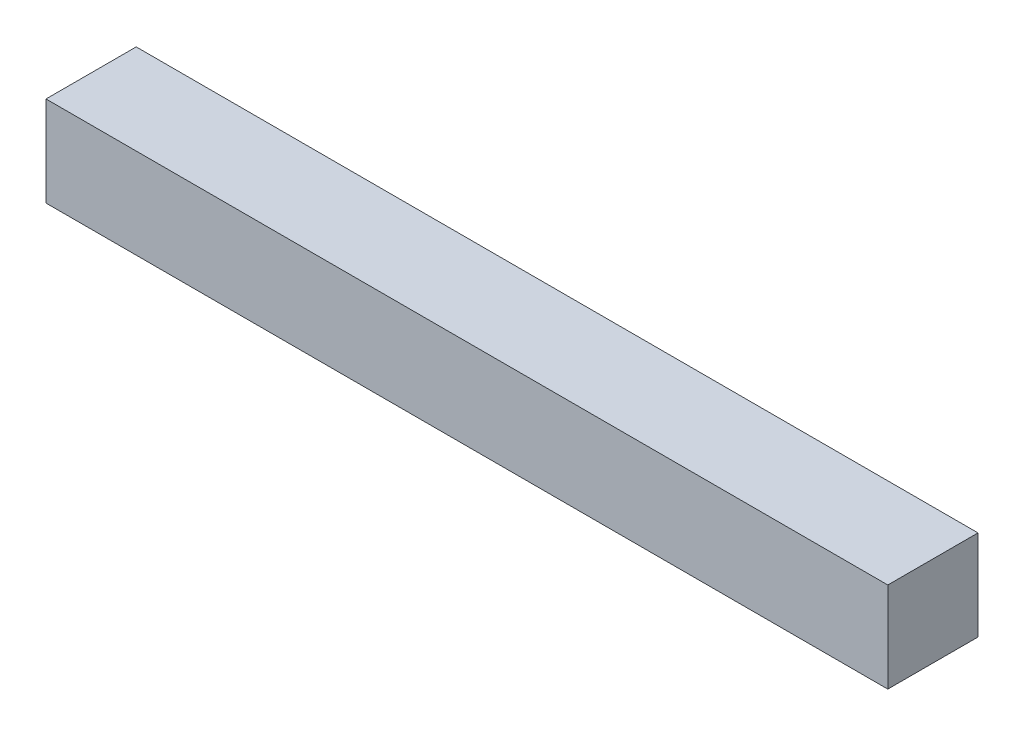
ISO-10303-21;
HEADER;
FILE_DESCRIPTION(('STEP AP214'),'2;1');
FILE_NAME('part.step','',(''),(''),'','','');
FILE_SCHEMA(('AUTOMOTIVE_DESIGN { 1 0 10303 214 1 1 1 1 }'));
ENDSEC;
DATA;
#1=APPLICATION_CONTEXT('core data for automotive mechanical design processes');
#2=APPLICATION_PROTOCOL_DEFINITION('international standard','automotive_design',2000,#1);
#3=PRODUCT_CONTEXT('',#1,'mechanical');
#4=PRODUCT('Part','Part','',(#3));
#5=PRODUCT_RELATED_PRODUCT_CATEGORY('part','',(#4));
#6=PRODUCT_DEFINITION_FORMATION('','',#4);
#7=PRODUCT_DEFINITION_CONTEXT('part definition',#1,'design');
#8=PRODUCT_DEFINITION('design','',#6,#7);
#9=PRODUCT_DEFINITION_SHAPE('','',#8);
#10=(LENGTH_UNIT() NAMED_UNIT(*) SI_UNIT(.MILLI.,.METRE.));
#11=(NAMED_UNIT(*) PLANE_ANGLE_UNIT() SI_UNIT($,.RADIAN.));
#12=(NAMED_UNIT(*) SI_UNIT($,.STERADIAN.) SOLID_ANGLE_UNIT());
#13=UNCERTAINTY_MEASURE_WITH_UNIT(LENGTH_MEASURE(1.E-05),#10,'distance_accuracy_value','');
#14=(GEOMETRIC_REPRESENTATION_CONTEXT(3) GLOBAL_UNCERTAINTY_ASSIGNED_CONTEXT((#13)) GLOBAL_UNIT_ASSIGNED_CONTEXT((#10,
#11,#12)) REPRESENTATION_CONTEXT('',''));
#15=CARTESIAN_POINT('',(0.,0.,0.));
#16=DIRECTION('',(0.,0.,1.));
#17=DIRECTION('',(1.,0.,0.));
#18=AXIS2_PLACEMENT_3D('',#15,#16,#17);
#19=CARTESIAN_POINT('',(140.,15.,30.));
#20=DIRECTION('',(-1.,0.,0.));
#21=DIRECTION('',(0.,0.,1.));
#22=AXIS2_PLACEMENT_3D('',#19,#20,#21);
#23=PLANE('',#22);
#24=DIRECTION('',(0.,1.,0.));
#25=VECTOR('',#24,1.);
#26=CARTESIAN_POINT('',(140.,15.,0.));
#27=LINE('',#26,#25);
#28=CARTESIAN_POINT('',(140.,-15.,0.));
#29=VERTEX_POINT('',#28);
#30=CARTESIAN_POINT('',(140.,15.,0.));
#31=VERTEX_POINT('',#30);
#32=EDGE_CURVE('E96',#29,#31,#27,.T.);
#33=ORIENTED_EDGE('',*,*,#32,.T.);
#34=DIRECTION('',(0.,0.,-1.));
#35=VECTOR('',#34,1.);
#36=CARTESIAN_POINT('',(140.,15.,30.));
#37=LINE('',#36,#35);
#38=CARTESIAN_POINT('',(140.,15.,30.));
#39=VERTEX_POINT('',#38);
#40=EDGE_CURVE('E11',#39,#31,#37,.T.);
#41=ORIENTED_EDGE('',*,*,#40,.F.);
#42=DIRECTION('',(0.,1.,0.));
#43=VECTOR('',#42,1.);
#44=CARTESIAN_POINT('',(140.,15.,30.));
#45=LINE('',#44,#43);
#46=CARTESIAN_POINT('',(140.,-15.,30.));
#47=VERTEX_POINT('',#46);
#48=EDGE_CURVE('E84',#47,#39,#45,.T.);
#49=ORIENTED_EDGE('',*,*,#48,.F.);
#50=DIRECTION('',(0.,0.,-1.));
#51=VECTOR('',#50,1.);
#52=CARTESIAN_POINT('',(140.,-15.,30.));
#53=LINE('',#52,#51);
#54=EDGE_CURVE('E92',#47,#29,#53,.T.);
#55=ORIENTED_EDGE('',*,*,#54,.T.);
#56=EDGE_LOOP('',(#33,#41,#49,#55));
#57=FACE_BOUND('',#56,.T.);
#58=ADVANCED_FACE('F33',(#57),#23,.F.);
#59=CARTESIAN_POINT('',(-140.,15.,30.));
#60=DIRECTION('',(0.,-1.,0.));
#61=DIRECTION('',(0.,0.,-1.));
#62=AXIS2_PLACEMENT_3D('',#59,#60,#61);
#63=PLANE('',#62);
#64=DIRECTION('',(-1.,0.,0.));
#65=VECTOR('',#64,1.);
#66=CARTESIAN_POINT('',(-140.,15.,0.));
#67=LINE('',#66,#65);
#68=CARTESIAN_POINT('',(-140.,15.,0.));
#69=VERTEX_POINT('',#68);
#70=EDGE_CURVE('E88',#31,#69,#67,.T.);
#71=ORIENTED_EDGE('',*,*,#70,.T.);
#72=DIRECTION('',(0.,0.,-1.));
#73=VECTOR('',#72,1.);
#74=CARTESIAN_POINT('',(-140.,15.,30.));
#75=LINE('',#74,#73);
#76=CARTESIAN_POINT('',(-140.,15.,30.));
#77=VERTEX_POINT('',#76);
#78=EDGE_CURVE('E41',#77,#69,#75,.T.);
#79=ORIENTED_EDGE('',*,*,#78,.F.);
#80=DIRECTION('',(-1.,0.,0.));
#81=VECTOR('',#80,1.);
#82=CARTESIAN_POINT('',(-140.,15.,30.));
#83=LINE('',#82,#81);
#84=EDGE_CURVE('E79',#39,#77,#83,.T.);
#85=ORIENTED_EDGE('',*,*,#84,.F.);
#86=ORIENTED_EDGE('',*,*,#40,.T.);
#87=EDGE_LOOP('',(#71,#79,#85,#86));
#88=FACE_BOUND('',#87,.T.);
#89=ADVANCED_FACE('F87',(#88),#63,.F.);
#90=CARTESIAN_POINT('',(-140.,15.,30.));
#91=DIRECTION('',(1.,0.,0.));
#92=DIRECTION('',(0.,0.,-1.));
#93=AXIS2_PLACEMENT_3D('',#90,#91,#92);
#94=PLANE('',#93);
#95=DIRECTION('',(0.,-1.,0.));
#96=VECTOR('',#95,1.);
#97=CARTESIAN_POINT('',(-140.,15.,0.));
#98=LINE('',#97,#96);
#99=CARTESIAN_POINT('',(-140.,-15.,0.));
#100=VERTEX_POINT('',#99);
#101=EDGE_CURVE('E66',#69,#100,#98,.T.);
#102=ORIENTED_EDGE('',*,*,#101,.T.);
#103=DIRECTION('',(0.,0.,-1.));
#104=VECTOR('',#103,1.);
#105=CARTESIAN_POINT('',(-140.,-15.,30.));
#106=LINE('',#105,#104);
#107=CARTESIAN_POINT('',(-140.,-15.,30.));
#108=VERTEX_POINT('',#107);
#109=EDGE_CURVE('E89',#108,#100,#106,.T.);
#110=ORIENTED_EDGE('',*,*,#109,.F.);
#111=DIRECTION('',(0.,-1.,0.));
#112=VECTOR('',#111,1.);
#113=CARTESIAN_POINT('',(-140.,15.,30.));
#114=LINE('',#113,#112);
#115=EDGE_CURVE('E82',#77,#108,#114,.T.);
#116=ORIENTED_EDGE('',*,*,#115,.F.);
#117=ORIENTED_EDGE('',*,*,#78,.T.);
#118=EDGE_LOOP('',(#102,#110,#116,#117));
#119=FACE_BOUND('',#118,.T.);
#120=ADVANCED_FACE('F90',(#119),#94,.F.);
#121=CARTESIAN_POINT('',(-140.,-15.,30.));
#122=DIRECTION('',(0.,1.,0.));
#123=DIRECTION('',(0.,0.,1.));
#124=AXIS2_PLACEMENT_3D('',#121,#122,#123);
#125=PLANE('',#124);
#126=DIRECTION('',(1.,0.,0.));
#127=VECTOR('',#126,1.);
#128=CARTESIAN_POINT('',(-140.,-15.,0.));
#129=LINE('',#128,#127);
#130=EDGE_CURVE('E72',#100,#29,#129,.T.);
#131=ORIENTED_EDGE('',*,*,#130,.T.);
#132=ORIENTED_EDGE('',*,*,#54,.F.);
#133=DIRECTION('',(1.,0.,0.));
#134=VECTOR('',#133,1.);
#135=CARTESIAN_POINT('',(-140.,-15.,30.));
#136=LINE('',#135,#134);
#137=EDGE_CURVE('E49',#108,#47,#136,.T.);
#138=ORIENTED_EDGE('',*,*,#137,.F.);
#139=ORIENTED_EDGE('',*,*,#109,.T.);
#140=EDGE_LOOP('',(#131,#132,#138,#139));
#141=FACE_BOUND('',#140,.T.);
#142=ADVANCED_FACE('F103',(#141),#125,.F.);
#143=CARTESIAN_POINT('',(0.,0.,30.));
#144=DIRECTION('',(0.,0.,1.));
#145=DIRECTION('',(1.,0.,0.));
#146=AXIS2_PLACEMENT_3D('',#143,#144,#145);
#147=PLANE('',#146);
#148=ORIENTED_EDGE('',*,*,#48,.T.);
#149=ORIENTED_EDGE('',*,*,#84,.T.);
#150=ORIENTED_EDGE('',*,*,#115,.T.);
#151=ORIENTED_EDGE('',*,*,#137,.T.);
#152=EDGE_LOOP('',(#148,#149,#150,#151));
#153=FACE_BOUND('',#152,.T.);
#154=ADVANCED_FACE('F80',(#153),#147,.T.);
#155=CARTESIAN_POINT('',(0.,0.,0.));
#156=DIRECTION('',(0.,0.,1.));
#157=DIRECTION('',(1.,0.,0.));
#158=AXIS2_PLACEMENT_3D('',#155,#156,#157);
#159=PLANE('',#158);
#160=ORIENTED_EDGE('',*,*,#32,.F.);
#161=ORIENTED_EDGE('',*,*,#130,.F.);
#162=ORIENTED_EDGE('',*,*,#101,.F.);
#163=ORIENTED_EDGE('',*,*,#70,.F.);
#164=EDGE_LOOP('',(#160,#161,#162,#163));
#165=FACE_BOUND('',#164,.T.);
#166=ADVANCED_FACE('F106',(#165),#159,.F.);
#167=CLOSED_SHELL('',(#58,#89,#120,#142,#154,#166));
#168=MANIFOLD_SOLID_BREP('B2',#167);
#169=ADVANCED_BREP_SHAPE_REPRESENTATION('',(#18,#168),#14);
#170=SHAPE_DEFINITION_REPRESENTATION(#9,#169);
ENDSEC;
END-ISO-10303-21;
